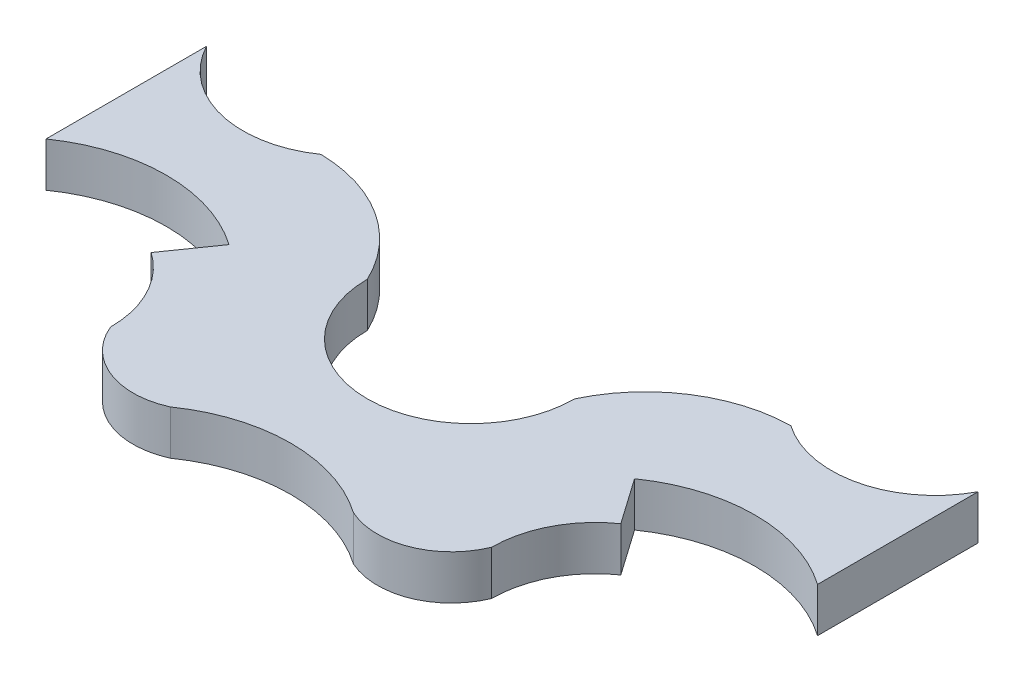
ISO-10303-21;
HEADER;
FILE_DESCRIPTION(('STEP AP214'),'2;1');
FILE_NAME('part.step','',(''),(''),'','','');
FILE_SCHEMA(('AUTOMOTIVE_DESIGN { 1 0 10303 214 1 1 1 1 }'));
ENDSEC;
DATA;
#1=APPLICATION_CONTEXT('core data for automotive mechanical design processes');
#2=APPLICATION_PROTOCOL_DEFINITION('international standard','automotive_design',2000,#1);
#3=PRODUCT_CONTEXT('',#1,'mechanical');
#4=PRODUCT('Part','Part','',(#3));
#5=PRODUCT_RELATED_PRODUCT_CATEGORY('part','',(#4));
#6=PRODUCT_DEFINITION_FORMATION('','',#4);
#7=PRODUCT_DEFINITION_CONTEXT('part definition',#1,'design');
#8=PRODUCT_DEFINITION('design','',#6,#7);
#9=PRODUCT_DEFINITION_SHAPE('','',#8);
#10=(LENGTH_UNIT() NAMED_UNIT(*) SI_UNIT(.MILLI.,.METRE.));
#11=(NAMED_UNIT(*) PLANE_ANGLE_UNIT() SI_UNIT($,.RADIAN.));
#12=(NAMED_UNIT(*) SI_UNIT($,.STERADIAN.) SOLID_ANGLE_UNIT());
#13=UNCERTAINTY_MEASURE_WITH_UNIT(LENGTH_MEASURE(1.E-05),#10,'distance_accuracy_value','');
#14=(GEOMETRIC_REPRESENTATION_CONTEXT(3) GLOBAL_UNCERTAINTY_ASSIGNED_CONTEXT((#13)) GLOBAL_UNIT_ASSIGNED_CONTEXT((#10,
#11,#12)) REPRESENTATION_CONTEXT('',''));
#15=CARTESIAN_POINT('',(0.,0.,0.));
#16=DIRECTION('',(0.,0.,1.));
#17=DIRECTION('',(1.,0.,0.));
#18=AXIS2_PLACEMENT_3D('',#15,#16,#17);
#19=CARTESIAN_POINT('',(-19.8752830168529,3.,-11.4749999999999));
#20=DIRECTION('',(0.,-1.,0.));
#21=DIRECTION('',(0.,0.,-1.));
#22=AXIS2_PLACEMENT_3D('',#19,#20,#21);
#23=CYLINDRICAL_SURFACE('',#22,10.775);
#24=CARTESIAN_POINT('',(-19.8752830168529,0.,-11.4749999999999));
#25=DIRECTION('',(0.,-1.,0.));
#26=DIRECTION('',(0.,0.,-1.));
#27=AXIS2_PLACEMENT_3D('',#24,#25,#26);
#28=CIRCLE('',#27,10.775);
#29=CARTESIAN_POINT('',(-26.0555691185355,0.,-20.3013632772137));
#30=VERTEX_POINT('',#29);
#31=CARTESIAN_POINT('',(-13.6949969151704,0.,-20.3013632772138));
#32=VERTEX_POINT('',#31);
#33=EDGE_CURVE('E183',#30,#32,#28,.T.);
#34=ORIENTED_EDGE('',*,*,#33,.T.);
#35=DIRECTION('',(0.,-1.,0.));
#36=VECTOR('',#35,1.);
#37=CARTESIAN_POINT('',(-13.6949969151704,3.,-20.3013632772138));
#38=LINE('',#37,#36);
#39=CARTESIAN_POINT('',(-13.6949969151704,3.,-20.3013632772138));
#40=VERTEX_POINT('',#39);
#41=EDGE_CURVE('E11',#40,#32,#38,.T.);
#42=ORIENTED_EDGE('',*,*,#41,.F.);
#43=CARTESIAN_POINT('',(-19.8752830168529,3.,-11.4749999999999));
#44=DIRECTION('',(0.,-1.,0.));
#45=DIRECTION('',(0.,0.,-1.));
#46=AXIS2_PLACEMENT_3D('',#43,#44,#45);
#47=CIRCLE('',#46,10.775);
#48=CARTESIAN_POINT('',(-26.0555691185355,3.,-20.3013632772137));
#49=VERTEX_POINT('',#48);
#50=EDGE_CURVE('E213',#49,#40,#47,.T.);
#51=ORIENTED_EDGE('',*,*,#50,.F.);
#52=DIRECTION('',(0.,-1.,0.));
#53=VECTOR('',#52,1.);
#54=CARTESIAN_POINT('',(-26.0555691185355,3.,-20.3013632772137));
#55=LINE('',#54,#53);
#56=EDGE_CURVE('E179',#49,#30,#55,.T.);
#57=ORIENTED_EDGE('',*,*,#56,.T.);
#58=EDGE_LOOP('',(#34,#42,#51,#57));
#59=FACE_BOUND('',#58,.T.);
#60=ADVANCED_FACE('F39',(#59),#23,.F.);
#61=CARTESIAN_POINT('',(-13.6949969151704,3.,-20.3013632772138));
#62=DIRECTION('',(0.819152044288993,0.,0.573576436351044));
#63=DIRECTION('',(0.573576436351044,0.,-0.819152044288993));
#64=AXIS2_PLACEMENT_3D('',#61,#62,#63);
#65=PLANE('',#64);
#66=DIRECTION('',(-0.573576436351044,0.,0.819152044288993));
#67=VECTOR('',#66,1.);
#68=CARTESIAN_POINT('',(-13.6949969151704,0.,-20.3013632772138));
#69=LINE('',#68,#67);
#70=CARTESIAN_POINT('',(-15.8602479623956,0.,-17.2090643100228));
#71=VERTEX_POINT('',#70);
#72=EDGE_CURVE('E186',#32,#71,#69,.T.);
#73=ORIENTED_EDGE('',*,*,#72,.T.);
#74=DIRECTION('',(0.,-1.,0.));
#75=VECTOR('',#74,1.);
#76=CARTESIAN_POINT('',(-15.8602479623956,3.,-17.2090643100228));
#77=LINE('',#76,#75);
#78=CARTESIAN_POINT('',(-15.8602479623956,3.,-17.2090643100228));
#79=VERTEX_POINT('',#78);
#80=EDGE_CURVE('E47',#79,#71,#77,.T.);
#81=ORIENTED_EDGE('',*,*,#80,.F.);
#82=DIRECTION('',(-0.573576436351044,0.,0.819152044288993));
#83=VECTOR('',#82,1.);
#84=CARTESIAN_POINT('',(-13.6949969151704,3.,-20.3013632772138));
#85=LINE('',#84,#83);
#86=EDGE_CURVE('E122',#40,#79,#85,.T.);
#87=ORIENTED_EDGE('',*,*,#86,.F.);
#88=ORIENTED_EDGE('',*,*,#41,.T.);
#89=EDGE_LOOP('',(#73,#81,#87,#88));
#90=FACE_BOUND('',#89,.T.);
#91=ADVANCED_FACE('F311',(#90),#65,.F.);
#92=CARTESIAN_POINT('',(-19.8752830168529,3.,-11.4749999999999));
#93=DIRECTION('',(0.,-1.,0.));
#94=DIRECTION('',(0.,0.,-1.));
#95=AXIS2_PLACEMENT_3D('',#92,#93,#94);
#96=CYLINDRICAL_SURFACE('',#95,7.00000000000002);
#97=CARTESIAN_POINT('',(-19.8752830168529,0.,-11.4749999999999));
#98=DIRECTION('',(0.,-1.,0.));
#99=DIRECTION('',(0.,0.,-1.));
#100=AXIS2_PLACEMENT_3D('',#97,#98,#99);
#101=CIRCLE('',#100,7.00000000000002);
#102=CARTESIAN_POINT('',(-12.8752830168529,0.,-11.4749999999999));
#103=VERTEX_POINT('',#102);
#104=EDGE_CURVE('E188',#71,#103,#101,.T.);
#105=ORIENTED_EDGE('',*,*,#104,.T.);
#106=DIRECTION('',(0.,-1.,0.));
#107=VECTOR('',#106,1.);
#108=CARTESIAN_POINT('',(-12.8752830168529,3.,-11.4749999999999));
#109=LINE('',#108,#107);
#110=CARTESIAN_POINT('',(-12.8752830168529,3.,-11.4749999999999));
#111=VERTEX_POINT('',#110);
#112=EDGE_CURVE('E244',#111,#103,#109,.T.);
#113=ORIENTED_EDGE('',*,*,#112,.F.);
#114=CARTESIAN_POINT('',(-19.8752830168529,3.,-11.4749999999999));
#115=DIRECTION('',(0.,-1.,0.));
#116=DIRECTION('',(0.,0.,-1.));
#117=AXIS2_PLACEMENT_3D('',#114,#115,#116);
#118=CIRCLE('',#117,7.00000000000002);
#119=EDGE_CURVE('E252',#79,#111,#118,.T.);
#120=ORIENTED_EDGE('',*,*,#119,.F.);
#121=ORIENTED_EDGE('',*,*,#80,.T.);
#122=EDGE_LOOP('',(#105,#113,#120,#121));
#123=FACE_BOUND('',#122,.T.);
#124=ADVANCED_FACE('F250',(#123),#96,.F.);
#125=CARTESIAN_POINT('',(-8.25129203559565,3.,-13.3772900423571));
#126=DIRECTION('',(0.,-1.,0.));
#127=DIRECTION('',(0.,0.,-1.));
#128=AXIS2_PLACEMENT_3D('',#125,#126,#127);
#129=CYLINDRICAL_SURFACE('',#128,5.);
#130=CARTESIAN_POINT('',(-8.25129203559565,0.,-13.3772900423571));
#131=DIRECTION('',(0.,1.,0.));
#132=DIRECTION('',(0.,0.,1.));
#133=AXIS2_PLACEMENT_3D('',#130,#131,#132);
#134=CIRCLE('',#133,5.);
#135=CARTESIAN_POINT('',(-6.18028610168251,0.,-8.8263632772139));
#136=VERTEX_POINT('',#135);
#137=EDGE_CURVE('E190',#103,#136,#134,.T.);
#138=ORIENTED_EDGE('',*,*,#137,.T.);
#139=DIRECTION('',(0.,-1.,0.));
#140=VECTOR('',#139,1.);
#141=CARTESIAN_POINT('',(-6.18028610168251,3.,-8.8263632772139));
#142=LINE('',#141,#140);
#143=CARTESIAN_POINT('',(-6.18028610168251,3.,-8.8263632772139));
#144=VERTEX_POINT('',#143);
#145=EDGE_CURVE('E241',#144,#136,#142,.T.);
#146=ORIENTED_EDGE('',*,*,#145,.F.);
#147=CARTESIAN_POINT('',(-8.25129203559565,3.,-13.3772900423571));
#148=DIRECTION('',(0.,1.,0.));
#149=DIRECTION('',(0.,0.,1.));
#150=AXIS2_PLACEMENT_3D('',#147,#148,#149);
#151=CIRCLE('',#150,5.);
#152=EDGE_CURVE('E270',#111,#144,#151,.T.);
#153=ORIENTED_EDGE('',*,*,#152,.F.);
#154=ORIENTED_EDGE('',*,*,#112,.T.);
#155=EDGE_LOOP('',(#138,#146,#153,#154));
#156=FACE_BOUND('',#155,.T.);
#157=ADVANCED_FACE('F261',(#156),#129,.T.);
#158=CARTESIAN_POINT('',(0.,3.,0.));
#159=DIRECTION('',(0.,-1.,0.));
#160=DIRECTION('',(0.,0.,-1.));
#161=AXIS2_PLACEMENT_3D('',#158,#159,#160);
#162=CYLINDRICAL_SURFACE('',#161,10.775);
#163=CARTESIAN_POINT('',(0.,0.,0.));
#164=DIRECTION('',(0.,-1.,0.));
#165=DIRECTION('',(0.,0.,-1.));
#166=AXIS2_PLACEMENT_3D('',#163,#164,#165);
#167=CIRCLE('',#166,10.775);
#168=CARTESIAN_POINT('',(6.1802861016825,0.,-8.8263632772139));
#169=VERTEX_POINT('',#168);
#170=EDGE_CURVE('E192',#136,#169,#167,.T.);
#171=ORIENTED_EDGE('',*,*,#170,.T.);
#172=DIRECTION('',(0.,-1.,0.));
#173=VECTOR('',#172,1.);
#174=CARTESIAN_POINT('',(6.1802861016825,3.,-8.8263632772139));
#175=LINE('',#174,#173);
#176=CARTESIAN_POINT('',(6.1802861016825,3.,-8.8263632772139));
#177=VERTEX_POINT('',#176);
#178=EDGE_CURVE('E238',#177,#169,#175,.T.);
#179=ORIENTED_EDGE('',*,*,#178,.F.);
#180=CARTESIAN_POINT('',(0.,3.,0.));
#181=DIRECTION('',(0.,-1.,0.));
#182=DIRECTION('',(0.,0.,-1.));
#183=AXIS2_PLACEMENT_3D('',#180,#181,#182);
#184=CIRCLE('',#183,10.775);
#185=EDGE_CURVE('E267',#144,#177,#184,.T.);
#186=ORIENTED_EDGE('',*,*,#185,.F.);
#187=ORIENTED_EDGE('',*,*,#145,.T.);
#188=EDGE_LOOP('',(#171,#179,#186,#187));
#189=FACE_BOUND('',#188,.T.);
#190=ADVANCED_FACE('F265',(#189),#162,.F.);
#191=CARTESIAN_POINT('',(8.25129203559566,3.,-13.3772900423571));
#192=DIRECTION('',(0.,-1.,0.));
#193=DIRECTION('',(0.,0.,-1.));
#194=AXIS2_PLACEMENT_3D('',#191,#192,#193);
#195=CYLINDRICAL_SURFACE('',#194,5.);
#196=CARTESIAN_POINT('',(8.25129203559566,0.,-13.3772900423571));
#197=DIRECTION('',(0.,1.,0.));
#198=DIRECTION('',(0.,0.,1.));
#199=AXIS2_PLACEMENT_3D('',#196,#197,#198);
#200=CIRCLE('',#199,5.);
#201=CARTESIAN_POINT('',(12.8752830168529,0.,-11.4749999999999));
#202=VERTEX_POINT('',#201);
#203=EDGE_CURVE('E194',#169,#202,#200,.T.);
#204=ORIENTED_EDGE('',*,*,#203,.T.);
#205=DIRECTION('',(0.,-1.,0.));
#206=VECTOR('',#205,1.);
#207=CARTESIAN_POINT('',(12.8752830168529,3.,-11.4749999999999));
#208=LINE('',#207,#206);
#209=CARTESIAN_POINT('',(12.8752830168529,3.,-11.4749999999999));
#210=VERTEX_POINT('',#209);
#211=EDGE_CURVE('E235',#210,#202,#208,.T.);
#212=ORIENTED_EDGE('',*,*,#211,.F.);
#213=CARTESIAN_POINT('',(8.25129203559566,3.,-13.3772900423571));
#214=DIRECTION('',(0.,1.,0.));
#215=DIRECTION('',(0.,0.,1.));
#216=AXIS2_PLACEMENT_3D('',#213,#214,#215);
#217=CIRCLE('',#216,5.);
#218=EDGE_CURVE('E269',#177,#210,#217,.T.);
#219=ORIENTED_EDGE('',*,*,#218,.F.);
#220=ORIENTED_EDGE('',*,*,#178,.T.);
#221=EDGE_LOOP('',(#204,#212,#219,#220));
#222=FACE_BOUND('',#221,.T.);
#223=ADVANCED_FACE('F324',(#222),#195,.T.);
#224=CARTESIAN_POINT('',(19.8752830168529,3.,-11.4749999999999));
#225=DIRECTION('',(0.,-1.,0.));
#226=DIRECTION('',(0.,0.,-1.));
#227=AXIS2_PLACEMENT_3D('',#224,#225,#226);
#228=CYLINDRICAL_SURFACE('',#227,7.);
#229=CARTESIAN_POINT('',(19.8752830168529,0.,-11.4749999999999));
#230=DIRECTION('',(0.,-1.,0.));
#231=DIRECTION('',(0.,0.,1.));
#232=AXIS2_PLACEMENT_3D('',#229,#230,#231);
#233=CIRCLE('',#232,7.);
#234=CARTESIAN_POINT('',(15.8602479623956,0.,-17.2090643100228));
#235=VERTEX_POINT('',#234);
#236=EDGE_CURVE('E196',#202,#235,#233,.T.);
#237=ORIENTED_EDGE('',*,*,#236,.T.);
#238=DIRECTION('',(0.,-1.,0.));
#239=VECTOR('',#238,1.);
#240=CARTESIAN_POINT('',(15.8602479623956,3.,-17.2090643100228));
#241=LINE('',#240,#239);
#242=CARTESIAN_POINT('',(15.8602479623956,3.,-17.2090643100228));
#243=VERTEX_POINT('',#242);
#244=EDGE_CURVE('E232',#243,#235,#241,.T.);
#245=ORIENTED_EDGE('',*,*,#244,.F.);
#246=CARTESIAN_POINT('',(19.8752830168529,3.,-11.4749999999999));
#247=DIRECTION('',(0.,-1.,0.));
#248=DIRECTION('',(0.,0.,1.));
#249=AXIS2_PLACEMENT_3D('',#246,#247,#248);
#250=CIRCLE('',#249,7.);
#251=EDGE_CURVE('E272',#210,#243,#250,.T.);
#252=ORIENTED_EDGE('',*,*,#251,.F.);
#253=ORIENTED_EDGE('',*,*,#211,.T.);
#254=EDGE_LOOP('',(#237,#245,#252,#253));
#255=FACE_BOUND('',#254,.T.);
#256=ADVANCED_FACE('F327',(#255),#228,.F.);
#257=CARTESIAN_POINT('',(13.6949969151704,3.,-20.3013632772138));
#258=DIRECTION('',(-0.819152044288993,0.,0.573576436351044));
#259=DIRECTION('',(0.573576436351045,0.,0.819152044288993));
#260=AXIS2_PLACEMENT_3D('',#257,#258,#259);
#261=PLANE('',#260);
#262=DIRECTION('',(-0.573576436351045,0.,-0.819152044288993));
#263=VECTOR('',#262,1.);
#264=CARTESIAN_POINT('',(13.6949969151704,0.,-20.3013632772138));
#265=LINE('',#264,#263);
#266=CARTESIAN_POINT('',(13.6949969151704,0.,-20.3013632772138));
#267=VERTEX_POINT('',#266);
#268=EDGE_CURVE('E198',#235,#267,#265,.T.);
#269=ORIENTED_EDGE('',*,*,#268,.T.);
#270=DIRECTION('',(0.,-1.,0.));
#271=VECTOR('',#270,1.);
#272=CARTESIAN_POINT('',(13.6949969151704,3.,-20.3013632772138));
#273=LINE('',#272,#271);
#274=CARTESIAN_POINT('',(13.6949969151704,3.,-20.3013632772138));
#275=VERTEX_POINT('',#274);
#276=EDGE_CURVE('E229',#275,#267,#273,.T.);
#277=ORIENTED_EDGE('',*,*,#276,.F.);
#278=DIRECTION('',(-0.573576436351045,0.,-0.819152044288993));
#279=VECTOR('',#278,1.);
#280=CARTESIAN_POINT('',(13.6949969151704,3.,-20.3013632772138));
#281=LINE('',#280,#279);
#282=EDGE_CURVE('E278',#243,#275,#281,.T.);
#283=ORIENTED_EDGE('',*,*,#282,.F.);
#284=ORIENTED_EDGE('',*,*,#244,.T.);
#285=EDGE_LOOP('',(#269,#277,#283,#284));
#286=FACE_BOUND('',#285,.T.);
#287=ADVANCED_FACE('F331',(#286),#261,.F.);
#288=CARTESIAN_POINT('',(19.8752830168529,3.,-11.4749999999999));
#289=DIRECTION('',(0.,-1.,0.));
#290=DIRECTION('',(0.,0.,-1.));
#291=AXIS2_PLACEMENT_3D('',#288,#289,#290);
#292=CYLINDRICAL_SURFACE('',#291,10.775);
#293=CARTESIAN_POINT('',(19.8752830168529,0.,-11.4749999999999));
#294=DIRECTION('',(0.,-1.,0.));
#295=DIRECTION('',(0.,0.,-1.));
#296=AXIS2_PLACEMENT_3D('',#293,#294,#295);
#297=CIRCLE('',#296,10.775);
#298=CARTESIAN_POINT('',(26.0555691185354,0.,-20.3013632772138));
#299=VERTEX_POINT('',#298);
#300=EDGE_CURVE('E200',#267,#299,#297,.T.);
#301=ORIENTED_EDGE('',*,*,#300,.T.);
#302=DIRECTION('',(0.,-1.,0.));
#303=VECTOR('',#302,1.);
#304=CARTESIAN_POINT('',(26.0555691185354,3.,-20.3013632772138));
#305=LINE('',#304,#303);
#306=CARTESIAN_POINT('',(26.0555691185354,3.,-20.3013632772138));
#307=VERTEX_POINT('',#306);
#308=EDGE_CURVE('E226',#307,#299,#305,.T.);
#309=ORIENTED_EDGE('',*,*,#308,.F.);
#310=CARTESIAN_POINT('',(19.8752830168529,3.,-11.4749999999999));
#311=DIRECTION('',(0.,-1.,0.));
#312=DIRECTION('',(0.,0.,-1.));
#313=AXIS2_PLACEMENT_3D('',#310,#311,#312);
#314=CIRCLE('',#313,10.775);
#315=EDGE_CURVE('E280',#275,#307,#314,.T.);
#316=ORIENTED_EDGE('',*,*,#315,.F.);
#317=ORIENTED_EDGE('',*,*,#276,.T.);
#318=EDGE_LOOP('',(#301,#309,#316,#317));
#319=FACE_BOUND('',#318,.T.);
#320=ADVANCED_FACE('F335',(#319),#292,.F.);
#321=CARTESIAN_POINT('',(26.0555691185354,3.,-31.138046440646));
#322=DIRECTION('',(-1.,0.,0.));
#323=DIRECTION('',(0.,0.,1.));
#324=AXIS2_PLACEMENT_3D('',#321,#322,#323);
#325=PLANE('',#324);
#326=DIRECTION('',(0.,0.,-1.));
#327=VECTOR('',#326,1.);
#328=CARTESIAN_POINT('',(26.0555691185354,0.,-31.138046440646));
#329=LINE('',#328,#327);
#330=CARTESIAN_POINT('',(26.0555691185354,0.,-31.138046440646));
#331=VERTEX_POINT('',#330);
#332=EDGE_CURVE('E202',#299,#331,#329,.T.);
#333=ORIENTED_EDGE('',*,*,#332,.T.);
#334=DIRECTION('',(0.,-1.,0.));
#335=VECTOR('',#334,1.);
#336=CARTESIAN_POINT('',(26.0555691185354,3.,-31.138046440646));
#337=LINE('',#336,#335);
#338=CARTESIAN_POINT('',(26.0555691185354,3.,-31.138046440646));
#339=VERTEX_POINT('',#338);
#340=EDGE_CURVE('E223',#339,#331,#337,.T.);
#341=ORIENTED_EDGE('',*,*,#340,.F.);
#342=DIRECTION('',(0.,0.,-1.));
#343=VECTOR('',#342,1.);
#344=CARTESIAN_POINT('',(26.0555691185354,3.,-31.138046440646));
#345=LINE('',#344,#343);
#346=EDGE_CURVE('E282',#307,#339,#345,.T.);
#347=ORIENTED_EDGE('',*,*,#346,.F.);
#348=ORIENTED_EDGE('',*,*,#308,.T.);
#349=EDGE_LOOP('',(#333,#341,#347,#348));
#350=FACE_BOUND('',#349,.T.);
#351=ADVANCED_FACE('F339',(#350),#325,.F.);
#352=CARTESIAN_POINT('',(19.8752830168529,3.,-34.4249999999998));
#353=DIRECTION('',(0.,-1.,0.));
#354=DIRECTION('',(0.,0.,-1.));
#355=AXIS2_PLACEMENT_3D('',#352,#353,#354);
#356=CYLINDRICAL_SURFACE('',#355,6.99999999999995);
#357=CARTESIAN_POINT('',(19.8752830168529,0.,-34.4249999999998));
#358=DIRECTION('',(0.,-1.,0.));
#359=DIRECTION('',(0.,0.,-1.));
#360=AXIS2_PLACEMENT_3D('',#357,#358,#359);
#361=CIRCLE('',#360,6.99999999999995);
#362=CARTESIAN_POINT('',(15.8700792263387,0.,-28.6840643100229));
#363=VERTEX_POINT('',#362);
#364=EDGE_CURVE('E204',#331,#363,#361,.T.);
#365=ORIENTED_EDGE('',*,*,#364,.T.);
#366=DIRECTION('',(0.,-1.,0.));
#367=VECTOR('',#366,1.);
#368=CARTESIAN_POINT('',(15.8700792263387,3.,-28.6840643100229));
#369=LINE('',#368,#367);
#370=CARTESIAN_POINT('',(15.8700792263387,3.,-28.6840643100229));
#371=VERTEX_POINT('',#370);
#372=EDGE_CURVE('E220',#371,#363,#369,.T.);
#373=ORIENTED_EDGE('',*,*,#372,.F.);
#374=CARTESIAN_POINT('',(19.8752830168529,3.,-34.4249999999998));
#375=DIRECTION('',(0.,-1.,0.));
#376=DIRECTION('',(0.,0.,-1.));
#377=AXIS2_PLACEMENT_3D('',#374,#375,#376);
#378=CIRCLE('',#377,6.99999999999995);
#379=EDGE_CURVE('E284',#339,#371,#378,.T.);
#380=ORIENTED_EDGE('',*,*,#379,.F.);
#381=ORIENTED_EDGE('',*,*,#340,.T.);
#382=EDGE_LOOP('',(#365,#373,#380,#381));
#383=FACE_BOUND('',#382,.T.);
#384=ADVANCED_FACE('F343',(#383),#356,.F.);
#385=CARTESIAN_POINT('',(16.0451571243017,3.,-18.6855970410039));
#386=DIRECTION('',(0.,-1.,0.));
#387=DIRECTION('',(0.,0.,-1.));
#388=AXIS2_PLACEMENT_3D('',#385,#386,#387);
#389=CYLINDRICAL_SURFACE('',#388,10.);
#390=CARTESIAN_POINT('',(16.0451571243017,0.,-18.6855970410039));
#391=DIRECTION('',(0.,1.,0.));
#392=DIRECTION('',(0.,0.,-1.));
#393=AXIS2_PLACEMENT_3D('',#390,#391,#392);
#394=CIRCLE('',#393,10.);
#395=CARTESIAN_POINT('',(6.99999999999998,0.,-22.95));
#396=VERTEX_POINT('',#395);
#397=EDGE_CURVE('E206',#363,#396,#394,.T.);
#398=ORIENTED_EDGE('',*,*,#397,.T.);
#399=DIRECTION('',(0.,-1.,0.));
#400=VECTOR('',#399,1.);
#401=CARTESIAN_POINT('',(6.99999999999998,3.,-22.95));
#402=LINE('',#401,#400);
#403=CARTESIAN_POINT('',(6.99999999999998,3.,-22.95));
#404=VERTEX_POINT('',#403);
#405=EDGE_CURVE('E217',#404,#396,#402,.T.);
#406=ORIENTED_EDGE('',*,*,#405,.F.);
#407=CARTESIAN_POINT('',(16.0451571243017,3.,-18.6855970410039));
#408=DIRECTION('',(0.,1.,0.));
#409=DIRECTION('',(0.,0.,-1.));
#410=AXIS2_PLACEMENT_3D('',#407,#408,#409);
#411=CIRCLE('',#410,10.);
#412=EDGE_CURVE('E286',#371,#404,#411,.T.);
#413=ORIENTED_EDGE('',*,*,#412,.F.);
#414=ORIENTED_EDGE('',*,*,#372,.T.);
#415=EDGE_LOOP('',(#398,#406,#413,#414));
#416=FACE_BOUND('',#415,.T.);
#417=ADVANCED_FACE('F292',(#416),#389,.T.);
#418=CARTESIAN_POINT('',(0.,3.,-22.95));
#419=DIRECTION('',(0.,-1.,0.));
#420=DIRECTION('',(0.,0.,-1.));
#421=AXIS2_PLACEMENT_3D('',#418,#419,#420);
#422=CYLINDRICAL_SURFACE('',#421,7.);
#423=CARTESIAN_POINT('',(0.,0.,-22.95));
#424=DIRECTION('',(0.,-1.,0.));
#425=DIRECTION('',(0.,0.,1.));
#426=AXIS2_PLACEMENT_3D('',#423,#424,#425);
#427=CIRCLE('',#426,7.);
#428=CARTESIAN_POINT('',(-7.00000000000002,0.,-22.95));
#429=VERTEX_POINT('',#428);
#430=EDGE_CURVE('E208',#396,#429,#427,.T.);
#431=ORIENTED_EDGE('',*,*,#430,.T.);
#432=DIRECTION('',(0.,-1.,0.));
#433=VECTOR('',#432,1.);
#434=CARTESIAN_POINT('',(-7.00000000000002,3.,-22.95));
#435=LINE('',#434,#433);
#436=CARTESIAN_POINT('',(-7.00000000000002,3.,-22.95));
#437=VERTEX_POINT('',#436);
#438=EDGE_CURVE('E174',#437,#429,#435,.T.);
#439=ORIENTED_EDGE('',*,*,#438,.F.);
#440=CARTESIAN_POINT('',(0.,3.,-22.95));
#441=DIRECTION('',(0.,-1.,0.));
#442=DIRECTION('',(0.,0.,1.));
#443=AXIS2_PLACEMENT_3D('',#440,#441,#442);
#444=CIRCLE('',#443,7.);
#445=EDGE_CURVE('E165',#404,#437,#444,.T.);
#446=ORIENTED_EDGE('',*,*,#445,.F.);
#447=ORIENTED_EDGE('',*,*,#405,.T.);
#448=EDGE_LOOP('',(#431,#439,#446,#447));
#449=FACE_BOUND('',#448,.T.);
#450=ADVANCED_FACE('F296',(#449),#422,.F.);
#451=CARTESIAN_POINT('',(-16.0451571243017,3.,-18.6855970410039));
#452=DIRECTION('',(0.,-1.,0.));
#453=DIRECTION('',(0.,0.,-1.));
#454=AXIS2_PLACEMENT_3D('',#451,#452,#453);
#455=CYLINDRICAL_SURFACE('',#454,10.);
#456=CARTESIAN_POINT('',(-16.0451571243017,0.,-18.6855970410039));
#457=DIRECTION('',(0.,1.,0.));
#458=DIRECTION('',(0.,0.,-1.));
#459=AXIS2_PLACEMENT_3D('',#456,#457,#458);
#460=CIRCLE('',#459,10.);
#461=CARTESIAN_POINT('',(-15.8700792263387,0.,-28.684064310023));
#462=VERTEX_POINT('',#461);
#463=EDGE_CURVE('E173',#429,#462,#460,.T.);
#464=ORIENTED_EDGE('',*,*,#463,.T.);
#465=DIRECTION('',(0.,-1.,0.));
#466=VECTOR('',#465,1.);
#467=CARTESIAN_POINT('',(-15.8700792263387,3.,-28.684064310023));
#468=LINE('',#467,#466);
#469=CARTESIAN_POINT('',(-15.8700792263387,3.,-28.684064310023));
#470=VERTEX_POINT('',#469);
#471=EDGE_CURVE('E170',#470,#462,#468,.T.);
#472=ORIENTED_EDGE('',*,*,#471,.F.);
#473=CARTESIAN_POINT('',(-16.0451571243017,3.,-18.6855970410039));
#474=DIRECTION('',(0.,1.,0.));
#475=DIRECTION('',(0.,0.,-1.));
#476=AXIS2_PLACEMENT_3D('',#473,#474,#475);
#477=CIRCLE('',#476,10.);
#478=EDGE_CURVE('E159',#437,#470,#477,.T.);
#479=ORIENTED_EDGE('',*,*,#478,.F.);
#480=ORIENTED_EDGE('',*,*,#438,.T.);
#481=EDGE_LOOP('',(#464,#472,#479,#480));
#482=FACE_BOUND('',#481,.T.);
#483=ADVANCED_FACE('F171',(#482),#455,.T.);
#484=CARTESIAN_POINT('',(-19.875283016853,3.,-34.4249999999999));
#485=DIRECTION('',(0.,-1.,0.));
#486=DIRECTION('',(0.,0.,-1.));
#487=AXIS2_PLACEMENT_3D('',#484,#485,#486);
#488=CYLINDRICAL_SURFACE('',#487,7.00000000000002);
#489=CARTESIAN_POINT('',(-19.875283016853,0.,-34.4249999999999));
#490=DIRECTION('',(0.,-1.,0.));
#491=DIRECTION('',(0.,0.,1.));
#492=AXIS2_PLACEMENT_3D('',#489,#490,#491);
#493=CIRCLE('',#492,7.00000000000002);
#494=CARTESIAN_POINT('',(-26.0555691185355,0.,-31.1380464406459));
#495=VERTEX_POINT('',#494);
#496=EDGE_CURVE('E108',#462,#495,#493,.T.);
#497=ORIENTED_EDGE('',*,*,#496,.T.);
#498=DIRECTION('',(0.,-1.,0.));
#499=VECTOR('',#498,1.);
#500=CARTESIAN_POINT('',(-26.0555691185355,3.,-31.1380464406459));
#501=LINE('',#500,#499);
#502=CARTESIAN_POINT('',(-26.0555691185355,3.,-31.1380464406459));
#503=VERTEX_POINT('',#502);
#504=EDGE_CURVE('E175',#503,#495,#501,.T.);
#505=ORIENTED_EDGE('',*,*,#504,.F.);
#506=CARTESIAN_POINT('',(-19.875283016853,3.,-34.4249999999999));
#507=DIRECTION('',(0.,-1.,0.));
#508=DIRECTION('',(0.,0.,1.));
#509=AXIS2_PLACEMENT_3D('',#506,#507,#508);
#510=CIRCLE('',#509,7.00000000000002);
#511=EDGE_CURVE('E163',#470,#503,#510,.T.);
#512=ORIENTED_EDGE('',*,*,#511,.F.);
#513=ORIENTED_EDGE('',*,*,#471,.T.);
#514=EDGE_LOOP('',(#497,#505,#512,#513));
#515=FACE_BOUND('',#514,.T.);
#516=ADVANCED_FACE('F177',(#515),#488,.F.);
#517=CARTESIAN_POINT('',(-26.0555691185355,3.,-20.3013632772137));
#518=DIRECTION('',(1.,0.,0.));
#519=DIRECTION('',(0.,0.,-1.));
#520=AXIS2_PLACEMENT_3D('',#517,#518,#519);
#521=PLANE('',#520);
#522=DIRECTION('',(0.,0.,1.));
#523=VECTOR('',#522,1.);
#524=CARTESIAN_POINT('',(-26.0555691185355,0.,-20.3013632772137));
#525=LINE('',#524,#523);
#526=EDGE_CURVE('E114',#495,#30,#525,.T.);
#527=ORIENTED_EDGE('',*,*,#526,.T.);
#528=ORIENTED_EDGE('',*,*,#56,.F.);
#529=DIRECTION('',(0.,0.,1.));
#530=VECTOR('',#529,1.);
#531=CARTESIAN_POINT('',(-26.0555691185355,3.,-20.3013632772137));
#532=LINE('',#531,#530);
#533=EDGE_CURVE('E55',#503,#49,#532,.T.);
#534=ORIENTED_EDGE('',*,*,#533,.F.);
#535=ORIENTED_EDGE('',*,*,#504,.T.);
#536=EDGE_LOOP('',(#527,#528,#534,#535));
#537=FACE_BOUND('',#536,.T.);
#538=ADVANCED_FACE('F300',(#537),#521,.F.);
#539=CARTESIAN_POINT('',(-19.8752830168529,3.,-11.4749999999999));
#540=DIRECTION('',(0.,-1.,0.));
#541=DIRECTION('',(0.,0.,-1.));
#542=AXIS2_PLACEMENT_3D('',#539,#540,#541);
#543=PLANE('',#542);
#544=ORIENTED_EDGE('',*,*,#50,.T.);
#545=ORIENTED_EDGE('',*,*,#86,.T.);
#546=ORIENTED_EDGE('',*,*,#119,.T.);
#547=ORIENTED_EDGE('',*,*,#152,.T.);
#548=ORIENTED_EDGE('',*,*,#185,.T.);
#549=ORIENTED_EDGE('',*,*,#218,.T.);
#550=ORIENTED_EDGE('',*,*,#251,.T.);
#551=ORIENTED_EDGE('',*,*,#282,.T.);
#552=ORIENTED_EDGE('',*,*,#315,.T.);
#553=ORIENTED_EDGE('',*,*,#346,.T.);
#554=ORIENTED_EDGE('',*,*,#379,.T.);
#555=ORIENTED_EDGE('',*,*,#412,.T.);
#556=ORIENTED_EDGE('',*,*,#445,.T.);
#557=ORIENTED_EDGE('',*,*,#478,.T.);
#558=ORIENTED_EDGE('',*,*,#511,.T.);
#559=ORIENTED_EDGE('',*,*,#533,.T.);
#560=EDGE_LOOP('',(#544,#545,#546,#547,#548,#549,#550,#551,#552,#553,#554,#555,#556,#557,#558,#559));
#561=FACE_BOUND('',#560,.T.);
#562=ADVANCED_FACE('F161',(#561),#543,.F.);
#563=CARTESIAN_POINT('',(-19.8752830168529,0.,-11.4749999999999));
#564=DIRECTION('',(0.,-1.,0.));
#565=DIRECTION('',(0.,0.,-1.));
#566=AXIS2_PLACEMENT_3D('',#563,#564,#565);
#567=PLANE('',#566);
#568=ORIENTED_EDGE('',*,*,#33,.F.);
#569=ORIENTED_EDGE('',*,*,#526,.F.);
#570=ORIENTED_EDGE('',*,*,#496,.F.);
#571=ORIENTED_EDGE('',*,*,#463,.F.);
#572=ORIENTED_EDGE('',*,*,#430,.F.);
#573=ORIENTED_EDGE('',*,*,#397,.F.);
#574=ORIENTED_EDGE('',*,*,#364,.F.);
#575=ORIENTED_EDGE('',*,*,#332,.F.);
#576=ORIENTED_EDGE('',*,*,#300,.F.);
#577=ORIENTED_EDGE('',*,*,#268,.F.);
#578=ORIENTED_EDGE('',*,*,#236,.F.);
#579=ORIENTED_EDGE('',*,*,#203,.F.);
#580=ORIENTED_EDGE('',*,*,#170,.F.);
#581=ORIENTED_EDGE('',*,*,#137,.F.);
#582=ORIENTED_EDGE('',*,*,#104,.F.);
#583=ORIENTED_EDGE('',*,*,#72,.F.);
#584=EDGE_LOOP('',(#568,#569,#570,#571,#572,#573,#574,#575,#576,#577,#578,#579,#580,#581,#582,#583));
#585=FACE_BOUND('',#584,.T.);
#586=ADVANCED_FACE('F256',(#585),#567,.T.);
#587=CLOSED_SHELL('',(#60,#91,#124,#157,#190,#223,#256,#287,#320,#351,#384,#417,#450,#483,#516,
#538,#562,#586));
#588=MANIFOLD_SOLID_BREP('B2',#587);
#589=ADVANCED_BREP_SHAPE_REPRESENTATION('',(#18,#588),#14);
#590=SHAPE_DEFINITION_REPRESENTATION(#9,#589);
ENDSEC;
END-ISO-10303-21;
